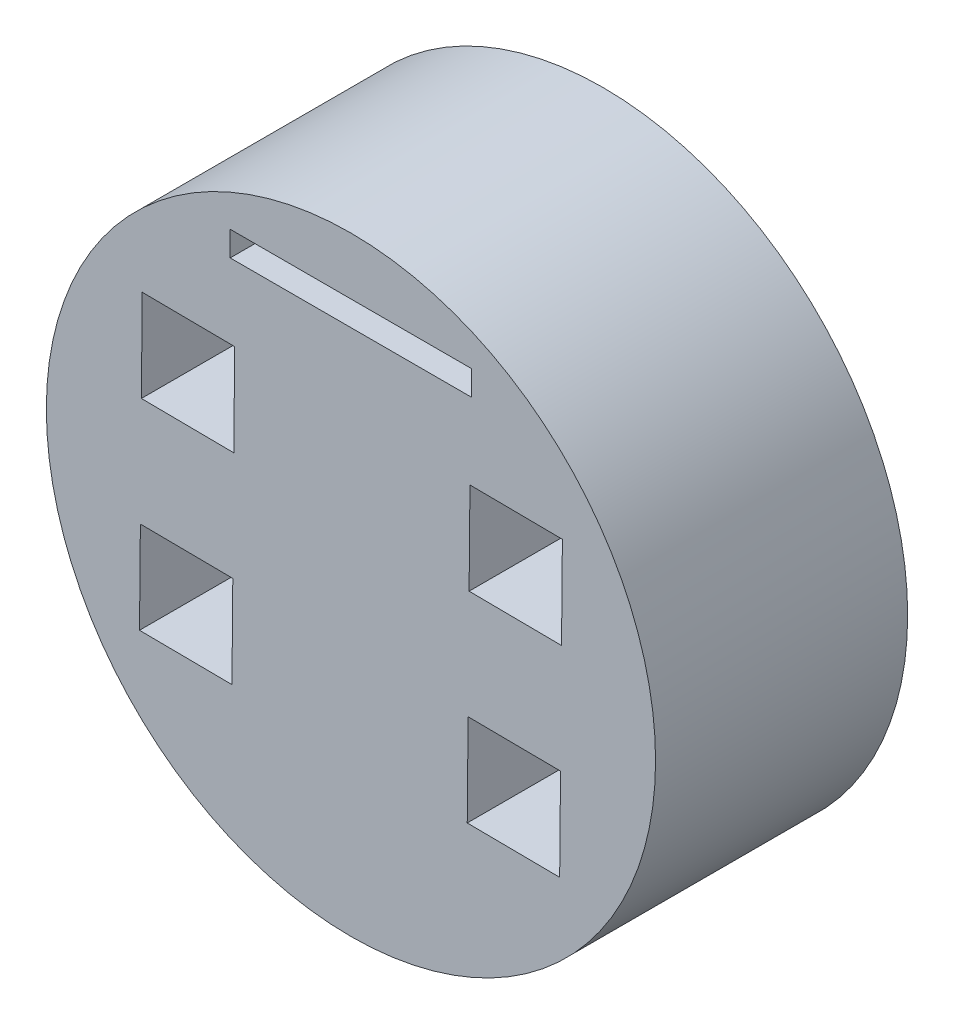
ISO-10303-21;
HEADER;
FILE_DESCRIPTION(('STEP AP214'),'2;1');
FILE_NAME('part.step','',(''),(''),'','','');
FILE_SCHEMA(('AUTOMOTIVE_DESIGN { 1 0 10303 214 1 1 1 1 }'));
ENDSEC;
DATA;
#1=APPLICATION_CONTEXT('core data for automotive mechanical design processes');
#2=APPLICATION_PROTOCOL_DEFINITION('international standard','automotive_design',2000,#1);
#3=PRODUCT_CONTEXT('',#1,'mechanical');
#4=PRODUCT('Part','Part','',(#3));
#5=PRODUCT_RELATED_PRODUCT_CATEGORY('part','',(#4));
#6=PRODUCT_DEFINITION_FORMATION('','',#4);
#7=PRODUCT_DEFINITION_CONTEXT('part definition',#1,'design');
#8=PRODUCT_DEFINITION('design','',#6,#7);
#9=PRODUCT_DEFINITION_SHAPE('','',#8);
#10=(LENGTH_UNIT() NAMED_UNIT(*) SI_UNIT(.MILLI.,.METRE.));
#11=(NAMED_UNIT(*) PLANE_ANGLE_UNIT() SI_UNIT($,.RADIAN.));
#12=(NAMED_UNIT(*) SI_UNIT($,.STERADIAN.) SOLID_ANGLE_UNIT());
#13=UNCERTAINTY_MEASURE_WITH_UNIT(LENGTH_MEASURE(1.E-05),#10,'distance_accuracy_value','');
#14=(GEOMETRIC_REPRESENTATION_CONTEXT(3) GLOBAL_UNCERTAINTY_ASSIGNED_CONTEXT((#13)) GLOBAL_UNIT_ASSIGNED_CONTEXT((#10,
#11,#12)) REPRESENTATION_CONTEXT('',''));
#15=CARTESIAN_POINT('',(0.,0.,0.));
#16=DIRECTION('',(0.,0.,1.));
#17=DIRECTION('',(1.,0.,0.));
#18=AXIS2_PLACEMENT_3D('',#15,#16,#17);
#19=CARTESIAN_POINT('',(0.,0.,76.2));
#20=DIRECTION('',(0.,0.,-1.));
#21=DIRECTION('',(-1.,0.,0.));
#22=AXIS2_PLACEMENT_3D('',#19,#20,#21);
#23=CYLINDRICAL_SURFACE('',#22,92.075);
#24=CARTESIAN_POINT('',(0.,0.,76.2));
#25=DIRECTION('',(0.,0.,1.));
#26=DIRECTION('',(1.,0.,0.));
#27=AXIS2_PLACEMENT_3D('',#24,#25,#26);
#28=CIRCLE('',#27,92.075);
#29=CARTESIAN_POINT('',(-92.075,0.,76.2));
#30=VERTEX_POINT('',#29);
#31=EDGE_CURVE('E11',#30,#30,#28,.T.);
#32=CARTESIAN_POINT('',(0.,0.,0.));
#33=DIRECTION('',(0.,0.,1.));
#34=DIRECTION('',(1.,0.,0.));
#35=AXIS2_PLACEMENT_3D('',#32,#33,#34);
#36=CIRCLE('',#35,92.075);
#37=CARTESIAN_POINT('',(-92.075,0.,0.));
#38=VERTEX_POINT('',#37);
#39=EDGE_CURVE('E38',#38,#38,#36,.T.);
#40=CARTESIAN_POINT('',(-92.075,0.,76.2));
#41=CARTESIAN_POINT('',(-92.075,0.,75.40625));
#42=CARTESIAN_POINT('',(-92.075,0.,74.6125));
#43=CARTESIAN_POINT('',(-92.075,0.,73.025));
#44=CARTESIAN_POINT('',(-92.075,0.,72.23125));
#45=CARTESIAN_POINT('',(-92.075,0.,70.64375));
#46=CARTESIAN_POINT('',(-92.075,0.,69.85));
#47=CARTESIAN_POINT('',(-92.075,0.,68.2625));
#48=CARTESIAN_POINT('',(-92.075,0.,67.46875));
#49=CARTESIAN_POINT('',(-92.075,0.,65.88125));
#50=CARTESIAN_POINT('',(-92.075,0.,65.0875));
#51=CARTESIAN_POINT('',(-92.075,0.,63.5));
#52=CARTESIAN_POINT('',(-92.075,0.,62.70625));
#53=CARTESIAN_POINT('',(-92.075,0.,61.11875));
#54=CARTESIAN_POINT('',(-92.075,0.,60.325));
#55=CARTESIAN_POINT('',(-92.075,0.,58.7375));
#56=CARTESIAN_POINT('',(-92.075,0.,57.94375));
#57=CARTESIAN_POINT('',(-92.075,0.,56.35625));
#58=CARTESIAN_POINT('',(-92.075,0.,55.5625));
#59=CARTESIAN_POINT('',(-92.075,0.,53.975));
#60=CARTESIAN_POINT('',(-92.075,0.,53.18125));
#61=CARTESIAN_POINT('',(-92.075,0.,51.59375));
#62=CARTESIAN_POINT('',(-92.075,0.,50.8));
#63=CARTESIAN_POINT('',(-92.075,0.,49.2125));
#64=CARTESIAN_POINT('',(-92.075,0.,48.41875));
#65=CARTESIAN_POINT('',(-92.075,0.,46.83125));
#66=CARTESIAN_POINT('',(-92.075,0.,46.0375));
#67=CARTESIAN_POINT('',(-92.075,0.,44.45));
#68=CARTESIAN_POINT('',(-92.075,0.,43.65625));
#69=CARTESIAN_POINT('',(-92.075,0.,42.06875));
#70=CARTESIAN_POINT('',(-92.075,0.,41.275));
#71=CARTESIAN_POINT('',(-92.075,0.,39.6875));
#72=CARTESIAN_POINT('',(-92.075,0.,38.89375));
#73=CARTESIAN_POINT('',(-92.075,0.,37.30625));
#74=CARTESIAN_POINT('',(-92.075,0.,36.5125));
#75=CARTESIAN_POINT('',(-92.075,0.,34.925));
#76=CARTESIAN_POINT('',(-92.075,0.,34.13125));
#77=CARTESIAN_POINT('',(-92.075,0.,32.54375));
#78=CARTESIAN_POINT('',(-92.075,0.,31.75));
#79=CARTESIAN_POINT('',(-92.075,0.,30.1625));
#80=CARTESIAN_POINT('',(-92.075,0.,29.36875));
#81=CARTESIAN_POINT('',(-92.075,0.,27.78125));
#82=CARTESIAN_POINT('',(-92.075,0.,26.9875));
#83=CARTESIAN_POINT('',(-92.075,0.,25.4));
#84=CARTESIAN_POINT('',(-92.075,0.,24.60625));
#85=CARTESIAN_POINT('',(-92.075,0.,23.01875));
#86=CARTESIAN_POINT('',(-92.075,0.,22.225));
#87=CARTESIAN_POINT('',(-92.075,0.,20.6375));
#88=CARTESIAN_POINT('',(-92.075,0.,19.84375));
#89=CARTESIAN_POINT('',(-92.075,0.,18.25625));
#90=CARTESIAN_POINT('',(-92.075,0.,17.4625));
#91=CARTESIAN_POINT('',(-92.075,0.,15.875));
#92=CARTESIAN_POINT('',(-92.075,0.,15.08125));
#93=CARTESIAN_POINT('',(-92.075,0.,13.49375));
#94=CARTESIAN_POINT('',(-92.075,0.,12.7));
#95=CARTESIAN_POINT('',(-92.075,0.,11.1125));
#96=CARTESIAN_POINT('',(-92.075,0.,10.31875));
#97=CARTESIAN_POINT('',(-92.075,0.,8.73125));
#98=CARTESIAN_POINT('',(-92.075,0.,7.93750000000001));
#99=CARTESIAN_POINT('',(-92.075,0.,6.35));
#100=CARTESIAN_POINT('',(-92.075,0.,5.55625));
#101=CARTESIAN_POINT('',(-92.075,0.,3.96875));
#102=CARTESIAN_POINT('',(-92.075,0.,3.175));
#103=CARTESIAN_POINT('',(-92.075,0.,1.5875));
#104=CARTESIAN_POINT('',(-92.075,0.,0.793750000000001));
#105=CARTESIAN_POINT('',(-92.075,0.,0.));
#106=B_SPLINE_CURVE_WITH_KNOTS('',3,(#40,#41,#42,#43,#44,#45,#46,#47,#48,#49,#50,#51,#52,#53,
#54,#55,#56,#57,#58,#59,#60,#61,#62,#63,#64,#65,#66,#67,#68,#69,#70,#71,#72,#73,#74,#75,#76,#77,
#78,#79,#80,#81,#82,#83,#84,#85,#86,#87,#88,#89,#90,#91,#92,#93,#94,#95,#96,#97,#98,#99,#100,
#101,#102,#103,#104,#105),.UNSPECIFIED.,.F.,.F.,(4,2,2,2,2,2,2,2,2,2,2,2,2,2,2,2,2,2,2,2,2,2,2,
2,2,2,2,2,2,2,2,2,4),(0.,2.38124999999999,4.76249999999999,7.14374999999999,9.52499999999999,
11.90625,14.2875,16.66875,19.05,21.43125,23.8125,26.19375,28.575,30.95625,33.3375,35.71875,38.1,
40.48125,42.8625,45.24375,47.625,50.00625,52.3875,54.76875,57.15,59.53125,61.9125,64.29375,
66.675,69.05625,71.4375,73.81875,76.2),.UNSPECIFIED.);
#107=EDGE_CURVE('BSEAM35',#30,#38,#106,.T.);
#108=ORIENTED_EDGE('',*,*,#31,.F.);
#109=ORIENTED_EDGE('',*,*,#39,.T.);
#110=ORIENTED_EDGE('',*,*,#107,.T.);
#111=ORIENTED_EDGE('',*,*,#107,.F.);
#112=EDGE_LOOP('',(#108,#110,#109,#111));
#113=FACE_BOUND('',#112,.T.);
#114=ADVANCED_FACE('F35',(#113),#23,.T.);
#115=CARTESIAN_POINT('',(0.,0.,76.2));
#116=DIRECTION('',(0.,0.,1.));
#117=DIRECTION('',(1.,0.,0.));
#118=AXIS2_PLACEMENT_3D('',#115,#116,#117);
#119=PLANE('',#118);
#120=DIRECTION('',(0.,-1.,0.));
#121=VECTOR('',#120,1.);
#122=CARTESIAN_POINT('',(-36.5,74.81,76.2));
#123=LINE('',#122,#121);
#124=CARTESIAN_POINT('',(-36.5,74.81,76.2));
#125=VERTEX_POINT('',#124);
#126=CARTESIAN_POINT('',(-36.5,67.31,76.2));
#127=VERTEX_POINT('',#126);
#128=EDGE_CURVE('E49',#125,#127,#123,.T.);
#129=ORIENTED_EDGE('',*,*,#128,.F.);
#130=DIRECTION('',(-1.,0.,0.));
#131=VECTOR('',#130,1.);
#132=CARTESIAN_POINT('',(-36.5,74.81,76.2));
#133=LINE('',#132,#131);
#134=CARTESIAN_POINT('',(36.5,74.81,76.2));
#135=VERTEX_POINT('',#134);
#136=EDGE_CURVE('E190',#135,#125,#133,.T.);
#137=ORIENTED_EDGE('',*,*,#136,.F.);
#138=DIRECTION('',(0.,1.,0.));
#139=VECTOR('',#138,1.);
#140=CARTESIAN_POINT('',(36.5,74.81,76.2));
#141=LINE('',#140,#139);
#142=CARTESIAN_POINT('',(36.5,67.31,76.2));
#143=VERTEX_POINT('',#142);
#144=EDGE_CURVE('E174',#143,#135,#141,.T.);
#145=ORIENTED_EDGE('',*,*,#144,.F.);
#146=DIRECTION('',(1.,0.,0.));
#147=VECTOR('',#146,1.);
#148=CARTESIAN_POINT('',(-36.5,67.31,76.2));
#149=LINE('',#148,#147);
#150=EDGE_CURVE('E183',#127,#143,#149,.T.);
#151=ORIENTED_EDGE('',*,*,#150,.F.);
#152=EDGE_LOOP('',(#129,#137,#145,#151));
#153=FACE_BOUND('',#152,.T.);
#154=DIRECTION('',(-0.999957406624021,0.0092295686661168,0.));
#155=VECTOR('',#154,1.);
#156=CARTESIAN_POINT('',(63.649675499303,15.9232191730642,76.2));
#157=LINE('',#156,#155);
#158=CARTESIAN_POINT('',(63.649675499303,15.9232191730642,76.2));
#159=VERTEX_POINT('',#158);
#160=CARTESIAN_POINT('',(35.7108655582279,16.1810933215955,76.2));
#161=VERTEX_POINT('',#160);
#162=EDGE_CURVE('E205',#159,#161,#157,.T.);
#163=ORIENTED_EDGE('',*,*,#162,.T.);
#164=DIRECTION('',(0.00922956866611825,0.999957406624021,0.));
#165=VECTOR('',#164,1.);
#166=CARTESIAN_POINT('',(35.9687397067593,44.1199032626708,76.2));
#167=LINE('',#166,#165);
#168=CARTESIAN_POINT('',(35.9687397067593,44.1199032626708,76.2));
#169=VERTEX_POINT('',#168);
#170=EDGE_CURVE('E228',#161,#169,#167,.T.);
#171=ORIENTED_EDGE('',*,*,#170,.T.);
#172=DIRECTION('',(0.999957406624021,-0.00922956866611652,0.));
#173=VECTOR('',#172,1.);
#174=CARTESIAN_POINT('',(63.9075496478345,43.8620291141395,76.2));
#175=LINE('',#174,#173);
#176=CARTESIAN_POINT('',(63.9075496478345,43.8620291141395,76.2));
#177=VERTEX_POINT('',#176);
#178=EDGE_CURVE('E224',#169,#177,#175,.T.);
#179=ORIENTED_EDGE('',*,*,#178,.T.);
#180=DIRECTION('',(-0.00922956866612223,-0.999957406624021,0.));
#181=VECTOR('',#180,1.);
#182=CARTESIAN_POINT('',(63.9075496478345,43.8620291141395,76.2));
#183=LINE('',#182,#181);
#184=EDGE_CURVE('E219',#177,#159,#183,.T.);
#185=ORIENTED_EDGE('',*,*,#184,.T.);
#186=EDGE_LOOP('',(#163,#171,#179,#185));
#187=FACE_BOUND('',#186,.T.);
#188=DIRECTION('',(-0.00922956866611577,-0.999957406624021,0.));
#189=VECTOR('',#188,1.);
#190=CARTESIAN_POINT('',(-35.1482310523414,44.7763101862051,76.2));
#191=LINE('',#190,#189);
#192=CARTESIAN_POINT('',(-35.1482310523414,44.7763101862051,76.2));
#193=VERTEX_POINT('',#192);
#194=CARTESIAN_POINT('',(-35.4061052008727,16.8375002451298,76.2));
#195=VERTEX_POINT('',#194);
#196=EDGE_CURVE('E239',#193,#195,#191,.T.);
#197=ORIENTED_EDGE('',*,*,#196,.T.);
#198=DIRECTION('',(-0.999957406624021,0.00922956866611543,0.));
#199=VECTOR('',#198,1.);
#200=CARTESIAN_POINT('',(-63.3449151419479,17.095374393661,76.2));
#201=LINE('',#200,#199);
#202=CARTESIAN_POINT('',(-63.3449151419479,17.095374393661,76.2));
#203=VERTEX_POINT('',#202);
#204=EDGE_CURVE('E261',#195,#203,#201,.T.);
#205=ORIENTED_EDGE('',*,*,#204,.T.);
#206=DIRECTION('',(0.0092295686661113,0.999957406624021,0.));
#207=VECTOR('',#206,1.);
#208=CARTESIAN_POINT('',(-63.0870409934167,45.0341843347363,76.2));
#209=LINE('',#208,#207);
#210=CARTESIAN_POINT('',(-63.0870409934167,45.0341843347363,76.2));
#211=VERTEX_POINT('',#210);
#212=EDGE_CURVE('E257',#203,#211,#209,.T.);
#213=ORIENTED_EDGE('',*,*,#212,.T.);
#214=DIRECTION('',(0.999957406624021,-0.00922956866611501,0.));
#215=VECTOR('',#214,1.);
#216=CARTESIAN_POINT('',(-63.0870409934167,45.0341843347363,76.2));
#217=LINE('',#216,#215);
#218=EDGE_CURVE('E253',#211,#193,#217,.T.);
#219=ORIENTED_EDGE('',*,*,#218,.T.);
#220=EDGE_LOOP('',(#197,#205,#213,#219));
#221=FACE_BOUND('',#220,.T.);
#222=DIRECTION('',(0.999957406624021,-0.0092295686661168,0.));
#223=VECTOR('',#222,1.);
#224=CARTESIAN_POINT('',(-63.649675499303,-15.9232191730642,76.2));
#225=LINE('',#224,#223);
#226=CARTESIAN_POINT('',(-63.649675499303,-15.9232191730642,76.2));
#227=VERTEX_POINT('',#226);
#228=CARTESIAN_POINT('',(-35.7108655582279,-16.1810933215955,76.2));
#229=VERTEX_POINT('',#228);
#230=EDGE_CURVE('E271',#227,#229,#225,.T.);
#231=ORIENTED_EDGE('',*,*,#230,.T.);
#232=DIRECTION('',(-0.00922956866611702,-0.999957406624021,0.));
#233=VECTOR('',#232,1.);
#234=CARTESIAN_POINT('',(-35.9687397067592,-44.1199032626708,76.2));
#235=LINE('',#234,#233);
#236=CARTESIAN_POINT('',(-35.9687397067592,-44.1199032626708,76.2));
#237=VERTEX_POINT('',#236);
#238=EDGE_CURVE('E291',#229,#237,#235,.T.);
#239=ORIENTED_EDGE('',*,*,#238,.T.);
#240=DIRECTION('',(-0.999957406624021,0.00922956866611504,0.));
#241=VECTOR('',#240,1.);
#242=CARTESIAN_POINT('',(-63.9075496478344,-43.8620291141395,76.2));
#243=LINE('',#242,#241);
#244=CARTESIAN_POINT('',(-63.9075496478344,-43.8620291141395,76.2));
#245=VERTEX_POINT('',#244);
#246=EDGE_CURVE('E287',#237,#245,#243,.T.);
#247=ORIENTED_EDGE('',*,*,#246,.T.);
#248=DIRECTION('',(0.00922956866612023,0.999957406624021,0.));
#249=VECTOR('',#248,1.);
#250=CARTESIAN_POINT('',(-63.9075496478344,-43.8620291141395,76.2));
#251=LINE('',#250,#249);
#252=EDGE_CURVE('E283',#245,#227,#251,.T.);
#253=ORIENTED_EDGE('',*,*,#252,.T.);
#254=EDGE_LOOP('',(#231,#239,#247,#253));
#255=FACE_BOUND('',#254,.T.);
#256=DIRECTION('',(0.00922956866611825,0.999957406624021,0.));
#257=VECTOR('',#256,1.);
#258=CARTESIAN_POINT('',(35.1482310523414,-44.776310186205,76.2));
#259=LINE('',#258,#257);
#260=CARTESIAN_POINT('',(35.1482310523414,-44.776310186205,76.2));
#261=VERTEX_POINT('',#260);
#262=CARTESIAN_POINT('',(35.4061052008728,-16.8375002451298,76.2));
#263=VERTEX_POINT('',#262);
#264=EDGE_CURVE('E301',#261,#263,#259,.T.);
#265=ORIENTED_EDGE('',*,*,#264,.T.);
#266=DIRECTION('',(0.999957406624021,-0.00922956866611717,0.));
#267=VECTOR('',#266,1.);
#268=CARTESIAN_POINT('',(63.3449151419479,-17.0953743936611,76.2));
#269=LINE('',#268,#267);
#270=CARTESIAN_POINT('',(63.3449151419479,-17.0953743936611,76.2));
#271=VERTEX_POINT('',#270);
#272=EDGE_CURVE('E322',#263,#271,#269,.T.);
#273=ORIENTED_EDGE('',*,*,#272,.T.);
#274=DIRECTION('',(-0.0092295686661128,-0.999957406624021,0.));
#275=VECTOR('',#274,1.);
#276=CARTESIAN_POINT('',(63.0870409934167,-45.0341843347363,76.2));
#277=LINE('',#276,#275);
#278=CARTESIAN_POINT('',(63.0870409934167,-45.0341843347363,76.2));
#279=VERTEX_POINT('',#278);
#280=EDGE_CURVE('E318',#271,#279,#277,.T.);
#281=ORIENTED_EDGE('',*,*,#280,.T.);
#282=DIRECTION('',(-0.999957406624021,0.00922956866611625,0.));
#283=VECTOR('',#282,1.);
#284=CARTESIAN_POINT('',(63.0870409934167,-45.0341843347363,76.2));
#285=LINE('',#284,#283);
#286=EDGE_CURVE('E313',#279,#261,#285,.T.);
#287=ORIENTED_EDGE('',*,*,#286,.T.);
#288=EDGE_LOOP('',(#265,#273,#281,#287));
#289=FACE_BOUND('',#288,.T.);
#290=ORIENTED_EDGE('',*,*,#31,.T.);
#291=EDGE_LOOP('',(#290));
#292=FACE_BOUND('',#291,.T.);
#293=ADVANCED_FACE('F187',(#153,#187,#221,#255,#289,#292),#119,.T.);
#294=CARTESIAN_POINT('',(0.,0.,0.));
#295=DIRECTION('',(0.,0.,1.));
#296=DIRECTION('',(1.,0.,0.));
#297=AXIS2_PLACEMENT_3D('',#294,#295,#296);
#298=PLANE('',#297);
#299=DIRECTION('',(1.,0.,0.));
#300=VECTOR('',#299,1.);
#301=CARTESIAN_POINT('',(-36.5,74.81,0.));
#302=LINE('',#301,#300);
#303=CARTESIAN_POINT('',(-36.5,74.81,0.));
#304=VERTEX_POINT('',#303);
#305=CARTESIAN_POINT('',(36.5,74.81,0.));
#306=VERTEX_POINT('',#305);
#307=EDGE_CURVE('E561',#304,#306,#302,.T.);
#308=ORIENTED_EDGE('',*,*,#307,.F.);
#309=DIRECTION('',(0.,1.,0.));
#310=VECTOR('',#309,1.);
#311=CARTESIAN_POINT('',(-36.5,74.81,0.));
#312=LINE('',#311,#310);
#313=CARTESIAN_POINT('',(-36.5,67.31,0.));
#314=VERTEX_POINT('',#313);
#315=EDGE_CURVE('E202',#314,#304,#312,.T.);
#316=ORIENTED_EDGE('',*,*,#315,.F.);
#317=DIRECTION('',(-1.,0.,0.));
#318=VECTOR('',#317,1.);
#319=CARTESIAN_POINT('',(-36.5,67.31,0.));
#320=LINE('',#319,#318);
#321=CARTESIAN_POINT('',(36.5,67.31,0.));
#322=VERTEX_POINT('',#321);
#323=EDGE_CURVE('E199',#322,#314,#320,.T.);
#324=ORIENTED_EDGE('',*,*,#323,.F.);
#325=DIRECTION('',(0.,-1.,0.));
#326=VECTOR('',#325,1.);
#327=CARTESIAN_POINT('',(36.5,74.81,0.));
#328=LINE('',#327,#326);
#329=EDGE_CURVE('E177',#306,#322,#328,.T.);
#330=ORIENTED_EDGE('',*,*,#329,.F.);
#331=EDGE_LOOP('',(#308,#316,#324,#330));
#332=FACE_BOUND('',#331,.T.);
#333=DIRECTION('',(0.00922956866611825,0.999957406624021,0.));
#334=VECTOR('',#333,1.);
#335=CARTESIAN_POINT('',(35.9687397067593,44.1199032626708,0.));
#336=LINE('',#335,#334);
#337=CARTESIAN_POINT('',(35.7108655582279,16.1810933215955,0.));
#338=VERTEX_POINT('',#337);
#339=CARTESIAN_POINT('',(35.9687397067593,44.1199032626708,0.));
#340=VERTEX_POINT('',#339);
#341=EDGE_CURVE('E206',#338,#340,#336,.T.);
#342=ORIENTED_EDGE('',*,*,#341,.F.);
#343=DIRECTION('',(-0.999957406624021,0.00922956866611681,0.));
#344=VECTOR('',#343,1.);
#345=CARTESIAN_POINT('',(63.649675499303,15.9232191730642,0.));
#346=LINE('',#345,#344);
#347=CARTESIAN_POINT('',(63.649675499303,15.9232191730642,0.));
#348=VERTEX_POINT('',#347);
#349=EDGE_CURVE('E209',#348,#338,#346,.T.);
#350=ORIENTED_EDGE('',*,*,#349,.F.);
#351=DIRECTION('',(-0.00922956866612223,-0.999957406624021,0.));
#352=VECTOR('',#351,1.);
#353=CARTESIAN_POINT('',(63.9075496478345,43.8620291141395,0.));
#354=LINE('',#353,#352);
#355=CARTESIAN_POINT('',(63.9075496478345,43.8620291141395,0.));
#356=VERTEX_POINT('',#355);
#357=EDGE_CURVE('E212',#356,#348,#354,.T.);
#358=ORIENTED_EDGE('',*,*,#357,.F.);
#359=DIRECTION('',(0.999957406624021,-0.00922956866611652,0.));
#360=VECTOR('',#359,1.);
#361=CARTESIAN_POINT('',(63.9075496478345,43.8620291141395,0.));
#362=LINE('',#361,#360);
#363=EDGE_CURVE('E203',#340,#356,#362,.T.);
#364=ORIENTED_EDGE('',*,*,#363,.F.);
#365=EDGE_LOOP('',(#342,#350,#358,#364));
#366=FACE_BOUND('',#365,.T.);
#367=DIRECTION('',(-0.999957406624021,0.00922956866611543,0.));
#368=VECTOR('',#367,1.);
#369=CARTESIAN_POINT('',(-63.3449151419479,17.095374393661,0.));
#370=LINE('',#369,#368);
#371=CARTESIAN_POINT('',(-35.4061052008727,16.8375002451298,0.));
#372=VERTEX_POINT('',#371);
#373=CARTESIAN_POINT('',(-63.3449151419479,17.095374393661,0.));
#374=VERTEX_POINT('',#373);
#375=EDGE_CURVE('E240',#372,#374,#370,.T.);
#376=ORIENTED_EDGE('',*,*,#375,.F.);
#377=DIRECTION('',(-0.00922956866611576,-0.999957406624021,0.));
#378=VECTOR('',#377,1.);
#379=CARTESIAN_POINT('',(-35.1482310523414,44.7763101862051,0.));
#380=LINE('',#379,#378);
#381=CARTESIAN_POINT('',(-35.1482310523414,44.7763101862051,0.));
#382=VERTEX_POINT('',#381);
#383=EDGE_CURVE('E243',#382,#372,#380,.T.);
#384=ORIENTED_EDGE('',*,*,#383,.F.);
#385=DIRECTION('',(0.999957406624021,-0.00922956866611501,0.));
#386=VECTOR('',#385,1.);
#387=CARTESIAN_POINT('',(-63.0870409934167,45.0341843347363,0.));
#388=LINE('',#387,#386);
#389=CARTESIAN_POINT('',(-63.0870409934167,45.0341843347363,0.));
#390=VERTEX_POINT('',#389);
#391=EDGE_CURVE('E246',#390,#382,#388,.T.);
#392=ORIENTED_EDGE('',*,*,#391,.F.);
#393=DIRECTION('',(0.0092295686661113,0.999957406624021,0.));
#394=VECTOR('',#393,1.);
#395=CARTESIAN_POINT('',(-63.0870409934167,45.0341843347363,0.));
#396=LINE('',#395,#394);
#397=EDGE_CURVE('E237',#374,#390,#396,.T.);
#398=ORIENTED_EDGE('',*,*,#397,.F.);
#399=EDGE_LOOP('',(#376,#384,#392,#398));
#400=FACE_BOUND('',#399,.T.);
#401=DIRECTION('',(-0.00922956866611702,-0.999957406624021,0.));
#402=VECTOR('',#401,1.);
#403=CARTESIAN_POINT('',(-35.9687397067592,-44.1199032626708,0.));
#404=LINE('',#403,#402);
#405=CARTESIAN_POINT('',(-35.7108655582279,-16.1810933215955,0.));
#406=VERTEX_POINT('',#405);
#407=CARTESIAN_POINT('',(-35.9687397067592,-44.1199032626708,0.));
#408=VERTEX_POINT('',#407);
#409=EDGE_CURVE('E272',#406,#408,#404,.T.);
#410=ORIENTED_EDGE('',*,*,#409,.F.);
#411=DIRECTION('',(0.999957406624021,-0.00922956866611681,0.));
#412=VECTOR('',#411,1.);
#413=CARTESIAN_POINT('',(-63.649675499303,-15.9232191730642,0.));
#414=LINE('',#413,#412);
#415=CARTESIAN_POINT('',(-63.649675499303,-15.9232191730642,0.));
#416=VERTEX_POINT('',#415);
#417=EDGE_CURVE('E275',#416,#406,#414,.T.);
#418=ORIENTED_EDGE('',*,*,#417,.F.);
#419=DIRECTION('',(0.00922956866612023,0.999957406624021,0.));
#420=VECTOR('',#419,1.);
#421=CARTESIAN_POINT('',(-63.9075496478344,-43.8620291141395,0.));
#422=LINE('',#421,#420);
#423=CARTESIAN_POINT('',(-63.9075496478344,-43.8620291141395,0.));
#424=VERTEX_POINT('',#423);
#425=EDGE_CURVE('E201',#424,#416,#422,.T.);
#426=ORIENTED_EDGE('',*,*,#425,.F.);
#427=DIRECTION('',(-0.999957406624021,0.00922956866611504,0.));
#428=VECTOR('',#427,1.);
#429=CARTESIAN_POINT('',(-63.9075496478344,-43.8620291141395,0.));
#430=LINE('',#429,#428);
#431=EDGE_CURVE('E269',#408,#424,#430,.T.);
#432=ORIENTED_EDGE('',*,*,#431,.F.);
#433=EDGE_LOOP('',(#410,#418,#426,#432));
#434=FACE_BOUND('',#433,.T.);
#435=DIRECTION('',(0.999957406624021,-0.00922956866611717,0.));
#436=VECTOR('',#435,1.);
#437=CARTESIAN_POINT('',(63.3449151419479,-17.0953743936611,0.));
#438=LINE('',#437,#436);
#439=CARTESIAN_POINT('',(35.4061052008728,-16.8375002451298,0.));
#440=VERTEX_POINT('',#439);
#441=CARTESIAN_POINT('',(63.3449151419479,-17.0953743936611,0.));
#442=VERTEX_POINT('',#441);
#443=EDGE_CURVE('E302',#440,#442,#438,.T.);
#444=ORIENTED_EDGE('',*,*,#443,.F.);
#445=DIRECTION('',(0.00922956866611825,0.999957406624021,0.));
#446=VECTOR('',#445,1.);
#447=CARTESIAN_POINT('',(35.1482310523414,-44.776310186205,0.));
#448=LINE('',#447,#446);
#449=CARTESIAN_POINT('',(35.1482310523414,-44.776310186205,0.));
#450=VERTEX_POINT('',#449);
#451=EDGE_CURVE('E305',#450,#440,#448,.T.);
#452=ORIENTED_EDGE('',*,*,#451,.F.);
#453=DIRECTION('',(-0.999957406624021,0.00922956866611625,0.));
#454=VECTOR('',#453,1.);
#455=CARTESIAN_POINT('',(63.0870409934167,-45.0341843347363,0.));
#456=LINE('',#455,#454);
#457=CARTESIAN_POINT('',(63.0870409934167,-45.0341843347363,0.));
#458=VERTEX_POINT('',#457);
#459=EDGE_CURVE('E236',#458,#450,#456,.T.);
#460=ORIENTED_EDGE('',*,*,#459,.F.);
#461=DIRECTION('',(-0.0092295686661128,-0.999957406624021,0.));
#462=VECTOR('',#461,1.);
#463=CARTESIAN_POINT('',(63.0870409934167,-45.0341843347363,0.));
#464=LINE('',#463,#462);
#465=EDGE_CURVE('E299',#442,#458,#464,.T.);
#466=ORIENTED_EDGE('',*,*,#465,.F.);
#467=EDGE_LOOP('',(#444,#452,#460,#466));
#468=FACE_BOUND('',#467,.T.);
#469=ORIENTED_EDGE('',*,*,#39,.F.);
#470=EDGE_LOOP('',(#469));
#471=FACE_BOUND('',#470,.T.);
#472=ADVANCED_FACE('F335',(#332,#366,#400,#434,#468,#471),#298,.F.);
#473=CARTESIAN_POINT('',(35.1482310523414,-44.776310186205,116.076133053471));
#474=DIRECTION('',(-0.999957406624021,0.00922956866611825,0.));
#475=DIRECTION('',(-0.00922956866611825,-0.999957406624021,0.));
#476=AXIS2_PLACEMENT_3D('',#473,#474,#475);
#477=PLANE('',#476);
#478=DIRECTION('',(0.,0.,-1.));
#479=VECTOR('',#478,1.);
#480=CARTESIAN_POINT('',(35.1482310523414,-44.776310186205,116.076133053471));
#481=LINE('',#480,#479);
#482=EDGE_CURVE('E316',#261,#450,#481,.T.);
#483=ORIENTED_EDGE('',*,*,#482,.T.);
#484=ORIENTED_EDGE('',*,*,#451,.T.);
#485=DIRECTION('',(0.,0.,-1.));
#486=VECTOR('',#485,1.);
#487=CARTESIAN_POINT('',(35.4061052008728,-16.8375002451298,116.076133053471));
#488=LINE('',#487,#486);
#489=EDGE_CURVE('E312',#263,#440,#488,.T.);
#490=ORIENTED_EDGE('',*,*,#489,.F.);
#491=ORIENTED_EDGE('',*,*,#264,.F.);
#492=EDGE_LOOP('',(#483,#484,#490,#491));
#493=FACE_BOUND('',#492,.T.);
#494=ADVANCED_FACE('F337',(#493),#477,.F.);
#495=CARTESIAN_POINT('',(63.3449151419479,-17.0953743936611,116.076133053471));
#496=DIRECTION('',(0.00922956866611717,0.999957406624021,0.));
#497=DIRECTION('',(-0.999957406624021,0.00922956866611717,0.));
#498=AXIS2_PLACEMENT_3D('',#495,#496,#497);
#499=PLANE('',#498);
#500=ORIENTED_EDGE('',*,*,#489,.T.);
#501=ORIENTED_EDGE('',*,*,#443,.T.);
#502=DIRECTION('',(0.,0.,-1.));
#503=VECTOR('',#502,1.);
#504=CARTESIAN_POINT('',(63.3449151419479,-17.0953743936611,116.076133053471));
#505=LINE('',#504,#503);
#506=EDGE_CURVE('E321',#271,#442,#505,.T.);
#507=ORIENTED_EDGE('',*,*,#506,.F.);
#508=ORIENTED_EDGE('',*,*,#272,.F.);
#509=EDGE_LOOP('',(#500,#501,#507,#508));
#510=FACE_BOUND('',#509,.T.);
#511=ADVANCED_FACE('F344',(#510),#499,.F.);
#512=CARTESIAN_POINT('',(63.0870409934167,-45.0341843347363,116.076133053471));
#513=DIRECTION('',(0.999957406624021,-0.0092295686661128,0.));
#514=DIRECTION('',(0.0092295686661128,0.999957406624021,0.));
#515=AXIS2_PLACEMENT_3D('',#512,#513,#514);
#516=PLANE('',#515);
#517=ORIENTED_EDGE('',*,*,#506,.T.);
#518=ORIENTED_EDGE('',*,*,#465,.T.);
#519=DIRECTION('',(0.,0.,-1.));
#520=VECTOR('',#519,1.);
#521=CARTESIAN_POINT('',(63.0870409934167,-45.0341843347363,116.076133053471));
#522=LINE('',#521,#520);
#523=EDGE_CURVE('E317',#279,#458,#522,.T.);
#524=ORIENTED_EDGE('',*,*,#523,.F.);
#525=ORIENTED_EDGE('',*,*,#280,.F.);
#526=EDGE_LOOP('',(#517,#518,#524,#525));
#527=FACE_BOUND('',#526,.T.);
#528=ADVANCED_FACE('F380',(#527),#516,.F.);
#529=CARTESIAN_POINT('',(63.0870409934167,-45.0341843347363,116.076133053471));
#530=DIRECTION('',(-0.00922956866611625,-0.999957406624021,0.));
#531=DIRECTION('',(0.999957406624021,-0.00922956866611625,0.));
#532=AXIS2_PLACEMENT_3D('',#529,#530,#531);
#533=PLANE('',#532);
#534=ORIENTED_EDGE('',*,*,#523,.T.);
#535=ORIENTED_EDGE('',*,*,#459,.T.);
#536=ORIENTED_EDGE('',*,*,#482,.F.);
#537=ORIENTED_EDGE('',*,*,#286,.F.);
#538=EDGE_LOOP('',(#534,#535,#536,#537));
#539=FACE_BOUND('',#538,.T.);
#540=ADVANCED_FACE('F388',(#539),#533,.F.);
#541=CARTESIAN_POINT('',(-63.649675499303,-15.9232191730642,116.076133053471));
#542=DIRECTION('',(0.0092295686661168,0.999957406624021,0.));
#543=DIRECTION('',(-0.999957406624021,0.0092295686661168,0.));
#544=AXIS2_PLACEMENT_3D('',#541,#542,#543);
#545=PLANE('',#544);
#546=DIRECTION('',(0.,0.,-1.));
#547=VECTOR('',#546,1.);
#548=CARTESIAN_POINT('',(-63.649675499303,-15.9232191730642,116.076133053471));
#549=LINE('',#548,#547);
#550=EDGE_CURVE('E249',#227,#416,#549,.T.);
#551=ORIENTED_EDGE('',*,*,#550,.T.);
#552=ORIENTED_EDGE('',*,*,#417,.T.);
#553=DIRECTION('',(0.,0.,-1.));
#554=VECTOR('',#553,1.);
#555=CARTESIAN_POINT('',(-35.7108655582279,-16.1810933215955,116.076133053471));
#556=LINE('',#555,#554);
#557=EDGE_CURVE('E282',#229,#406,#556,.T.);
#558=ORIENTED_EDGE('',*,*,#557,.F.);
#559=ORIENTED_EDGE('',*,*,#230,.F.);
#560=EDGE_LOOP('',(#551,#552,#558,#559));
#561=FACE_BOUND('',#560,.T.);
#562=ADVANCED_FACE('F396',(#561),#545,.F.);
#563=CARTESIAN_POINT('',(-35.9687397067592,-44.1199032626708,116.076133053471));
#564=DIRECTION('',(0.999957406624021,-0.00922956866611702,0.));
#565=DIRECTION('',(0.00922956866611702,0.999957406624021,0.));
#566=AXIS2_PLACEMENT_3D('',#563,#564,#565);
#567=PLANE('',#566);
#568=ORIENTED_EDGE('',*,*,#557,.T.);
#569=ORIENTED_EDGE('',*,*,#409,.T.);
#570=DIRECTION('',(0.,0.,-1.));
#571=VECTOR('',#570,1.);
#572=CARTESIAN_POINT('',(-35.9687397067592,-44.1199032626708,116.076133053471));
#573=LINE('',#572,#571);
#574=EDGE_CURVE('E290',#237,#408,#573,.T.);
#575=ORIENTED_EDGE('',*,*,#574,.F.);
#576=ORIENTED_EDGE('',*,*,#238,.F.);
#577=EDGE_LOOP('',(#568,#569,#575,#576));
#578=FACE_BOUND('',#577,.T.);
#579=ADVANCED_FACE('F404',(#578),#567,.F.);
#580=CARTESIAN_POINT('',(-63.9075496478344,-43.8620291141395,116.076133053471));
#581=DIRECTION('',(-0.00922956866611504,-0.999957406624021,0.));
#582=DIRECTION('',(0.999957406624021,-0.00922956866611504,0.));
#583=AXIS2_PLACEMENT_3D('',#580,#581,#582);
#584=PLANE('',#583);
#585=ORIENTED_EDGE('',*,*,#574,.T.);
#586=ORIENTED_EDGE('',*,*,#431,.T.);
#587=DIRECTION('',(0.,0.,-1.));
#588=VECTOR('',#587,1.);
#589=CARTESIAN_POINT('',(-63.9075496478344,-43.8620291141395,116.076133053471));
#590=LINE('',#589,#588);
#591=EDGE_CURVE('E286',#245,#424,#590,.T.);
#592=ORIENTED_EDGE('',*,*,#591,.F.);
#593=ORIENTED_EDGE('',*,*,#246,.F.);
#594=EDGE_LOOP('',(#585,#586,#592,#593));
#595=FACE_BOUND('',#594,.T.);
#596=ADVANCED_FACE('F412',(#595),#584,.F.);
#597=CARTESIAN_POINT('',(-63.9075496478344,-43.8620291141395,116.076133053471));
#598=DIRECTION('',(-0.999957406624021,0.00922956866612023,0.));
#599=DIRECTION('',(-0.00922956866612023,-0.999957406624021,0.));
#600=AXIS2_PLACEMENT_3D('',#597,#598,#599);
#601=PLANE('',#600);
#602=ORIENTED_EDGE('',*,*,#591,.T.);
#603=ORIENTED_EDGE('',*,*,#425,.T.);
#604=ORIENTED_EDGE('',*,*,#550,.F.);
#605=ORIENTED_EDGE('',*,*,#252,.F.);
#606=EDGE_LOOP('',(#602,#603,#604,#605));
#607=FACE_BOUND('',#606,.T.);
#608=ADVANCED_FACE('F420',(#607),#601,.F.);
#609=CARTESIAN_POINT('',(-35.1482310523414,44.7763101862051,116.076133053471));
#610=DIRECTION('',(0.999957406624021,-0.00922956866611577,0.));
#611=DIRECTION('',(0.00922956866611577,0.999957406624021,0.));
#612=AXIS2_PLACEMENT_3D('',#609,#610,#611);
#613=PLANE('',#612);
#614=DIRECTION('',(0.,0.,-1.));
#615=VECTOR('',#614,1.);
#616=CARTESIAN_POINT('',(-35.1482310523414,44.7763101862051,116.076133053471));
#617=LINE('',#616,#615);
#618=EDGE_CURVE('E215',#193,#382,#617,.T.);
#619=ORIENTED_EDGE('',*,*,#618,.T.);
#620=ORIENTED_EDGE('',*,*,#383,.T.);
#621=DIRECTION('',(0.,0.,-1.));
#622=VECTOR('',#621,1.);
#623=CARTESIAN_POINT('',(-35.4061052008727,16.8375002451298,116.076133053471));
#624=LINE('',#623,#622);
#625=EDGE_CURVE('E252',#195,#372,#624,.T.);
#626=ORIENTED_EDGE('',*,*,#625,.F.);
#627=ORIENTED_EDGE('',*,*,#196,.F.);
#628=EDGE_LOOP('',(#619,#620,#626,#627));
#629=FACE_BOUND('',#628,.T.);
#630=ADVANCED_FACE('F428',(#629),#613,.F.);
#631=CARTESIAN_POINT('',(-63.3449151419479,17.095374393661,116.076133053471));
#632=DIRECTION('',(-0.00922956866611543,-0.999957406624021,0.));
#633=DIRECTION('',(0.999957406624021,-0.00922956866611543,0.));
#634=AXIS2_PLACEMENT_3D('',#631,#632,#633);
#635=PLANE('',#634);
#636=ORIENTED_EDGE('',*,*,#625,.T.);
#637=ORIENTED_EDGE('',*,*,#375,.T.);
#638=DIRECTION('',(0.,0.,-1.));
#639=VECTOR('',#638,1.);
#640=CARTESIAN_POINT('',(-63.3449151419479,17.095374393661,116.076133053471));
#641=LINE('',#640,#639);
#642=EDGE_CURVE('E260',#203,#374,#641,.T.);
#643=ORIENTED_EDGE('',*,*,#642,.F.);
#644=ORIENTED_EDGE('',*,*,#204,.F.);
#645=EDGE_LOOP('',(#636,#637,#643,#644));
#646=FACE_BOUND('',#645,.T.);
#647=ADVANCED_FACE('F436',(#646),#635,.F.);
#648=CARTESIAN_POINT('',(-63.0870409934167,45.0341843347363,116.076133053471));
#649=DIRECTION('',(-0.999957406624021,0.0092295686661113,0.));
#650=DIRECTION('',(-0.0092295686661113,-0.999957406624021,0.));
#651=AXIS2_PLACEMENT_3D('',#648,#649,#650);
#652=PLANE('',#651);
#653=ORIENTED_EDGE('',*,*,#642,.T.);
#654=ORIENTED_EDGE('',*,*,#397,.T.);
#655=DIRECTION('',(0.,0.,-1.));
#656=VECTOR('',#655,1.);
#657=CARTESIAN_POINT('',(-63.0870409934167,45.0341843347363,116.076133053471));
#658=LINE('',#657,#656);
#659=EDGE_CURVE('E256',#211,#390,#658,.T.);
#660=ORIENTED_EDGE('',*,*,#659,.F.);
#661=ORIENTED_EDGE('',*,*,#212,.F.);
#662=EDGE_LOOP('',(#653,#654,#660,#661));
#663=FACE_BOUND('',#662,.T.);
#664=ADVANCED_FACE('F444',(#663),#652,.F.);
#665=CARTESIAN_POINT('',(-63.0870409934167,45.0341843347363,116.076133053471));
#666=DIRECTION('',(0.00922956866611501,0.999957406624021,0.));
#667=DIRECTION('',(-0.999957406624021,0.00922956866611501,0.));
#668=AXIS2_PLACEMENT_3D('',#665,#666,#667);
#669=PLANE('',#668);
#670=ORIENTED_EDGE('',*,*,#659,.T.);
#671=ORIENTED_EDGE('',*,*,#391,.T.);
#672=ORIENTED_EDGE('',*,*,#618,.F.);
#673=ORIENTED_EDGE('',*,*,#218,.F.);
#674=EDGE_LOOP('',(#670,#671,#672,#673));
#675=FACE_BOUND('',#674,.T.);
#676=ADVANCED_FACE('F452',(#675),#669,.F.);
#677=CARTESIAN_POINT('',(63.649675499303,15.9232191730642,116.076133053471));
#678=DIRECTION('',(-0.0092295686661168,-0.999957406624021,0.));
#679=DIRECTION('',(0.999957406624021,-0.0092295686661168,0.));
#680=AXIS2_PLACEMENT_3D('',#677,#678,#679);
#681=PLANE('',#680);
#682=DIRECTION('',(0.,0.,-1.));
#683=VECTOR('',#682,1.);
#684=CARTESIAN_POINT('',(63.649675499303,15.9232191730642,116.076133053471));
#685=LINE('',#684,#683);
#686=EDGE_CURVE('E222',#159,#348,#685,.T.);
#687=ORIENTED_EDGE('',*,*,#686,.T.);
#688=ORIENTED_EDGE('',*,*,#349,.T.);
#689=DIRECTION('',(0.,0.,-1.));
#690=VECTOR('',#689,1.);
#691=CARTESIAN_POINT('',(35.7108655582279,16.1810933215955,116.076133053471));
#692=LINE('',#691,#690);
#693=EDGE_CURVE('E218',#161,#338,#692,.T.);
#694=ORIENTED_EDGE('',*,*,#693,.F.);
#695=ORIENTED_EDGE('',*,*,#162,.F.);
#696=EDGE_LOOP('',(#687,#688,#694,#695));
#697=FACE_BOUND('',#696,.T.);
#698=ADVANCED_FACE('F460',(#697),#681,.F.);
#699=CARTESIAN_POINT('',(35.9687397067593,44.1199032626708,116.076133053471));
#700=DIRECTION('',(-0.999957406624021,0.00922956866611825,0.));
#701=DIRECTION('',(-0.00922956866611825,-0.999957406624021,0.));
#702=AXIS2_PLACEMENT_3D('',#699,#700,#701);
#703=PLANE('',#702);
#704=ORIENTED_EDGE('',*,*,#693,.T.);
#705=ORIENTED_EDGE('',*,*,#341,.T.);
#706=DIRECTION('',(0.,0.,-1.));
#707=VECTOR('',#706,1.);
#708=CARTESIAN_POINT('',(35.9687397067593,44.1199032626708,116.076133053471));
#709=LINE('',#708,#707);
#710=EDGE_CURVE('E227',#169,#340,#709,.T.);
#711=ORIENTED_EDGE('',*,*,#710,.F.);
#712=ORIENTED_EDGE('',*,*,#170,.F.);
#713=EDGE_LOOP('',(#704,#705,#711,#712));
#714=FACE_BOUND('',#713,.T.);
#715=ADVANCED_FACE('F468',(#714),#703,.F.);
#716=CARTESIAN_POINT('',(63.9075496478345,43.8620291141395,116.076133053471));
#717=DIRECTION('',(0.00922956866611652,0.999957406624021,0.));
#718=DIRECTION('',(-0.999957406624021,0.00922956866611652,0.));
#719=AXIS2_PLACEMENT_3D('',#716,#717,#718);
#720=PLANE('',#719);
#721=ORIENTED_EDGE('',*,*,#710,.T.);
#722=ORIENTED_EDGE('',*,*,#363,.T.);
#723=DIRECTION('',(0.,0.,-1.));
#724=VECTOR('',#723,1.);
#725=CARTESIAN_POINT('',(63.9075496478345,43.8620291141395,116.076133053471));
#726=LINE('',#725,#724);
#727=EDGE_CURVE('E223',#177,#356,#726,.T.);
#728=ORIENTED_EDGE('',*,*,#727,.F.);
#729=ORIENTED_EDGE('',*,*,#178,.F.);
#730=EDGE_LOOP('',(#721,#722,#728,#729));
#731=FACE_BOUND('',#730,.T.);
#732=ADVANCED_FACE('F476',(#731),#720,.F.);
#733=CARTESIAN_POINT('',(63.9075496478345,43.8620291141395,116.076133053471));
#734=DIRECTION('',(0.999957406624021,-0.00922956866612223,0.));
#735=DIRECTION('',(0.00922956866612223,0.999957406624021,0.));
#736=AXIS2_PLACEMENT_3D('',#733,#734,#735);
#737=PLANE('',#736);
#738=ORIENTED_EDGE('',*,*,#727,.T.);
#739=ORIENTED_EDGE('',*,*,#357,.T.);
#740=ORIENTED_EDGE('',*,*,#686,.F.);
#741=ORIENTED_EDGE('',*,*,#184,.F.);
#742=EDGE_LOOP('',(#738,#739,#740,#741));
#743=FACE_BOUND('',#742,.T.);
#744=ADVANCED_FACE('F484',(#743),#737,.F.);
#745=CARTESIAN_POINT('',(-36.5,74.81,-73.3842626180845));
#746=DIRECTION('',(-1.,0.,0.));
#747=DIRECTION('',(0.,-1.,0.));
#748=AXIS2_PLACEMENT_3D('',#745,#746,#747);
#749=PLANE('',#748);
#750=ORIENTED_EDGE('',*,*,#315,.T.);
#751=DIRECTION('',(0.,0.,1.));
#752=VECTOR('',#751,1.);
#753=CARTESIAN_POINT('',(-36.5,74.81,-73.3842626180845));
#754=LINE('',#753,#752);
#755=EDGE_CURVE('E195',#304,#125,#754,.T.);
#756=ORIENTED_EDGE('',*,*,#755,.T.);
#757=ORIENTED_EDGE('',*,*,#128,.T.);
#758=DIRECTION('',(0.,0.,1.));
#759=VECTOR('',#758,1.);
#760=CARTESIAN_POINT('',(-36.5,67.31,-73.3842626180845));
#761=LINE('',#760,#759);
#762=EDGE_CURVE('E180',#314,#127,#761,.T.);
#763=ORIENTED_EDGE('',*,*,#762,.F.);
#764=EDGE_LOOP('',(#750,#756,#757,#763));
#765=FACE_BOUND('',#764,.T.);
#766=ADVANCED_FACE('F491',(#765),#749,.F.);
#767=CARTESIAN_POINT('',(-36.5,74.81,-73.3842626180845));
#768=DIRECTION('',(0.,1.,0.));
#769=DIRECTION('',(-1.,0.,0.));
#770=AXIS2_PLACEMENT_3D('',#767,#768,#769);
#771=PLANE('',#770);
#772=ORIENTED_EDGE('',*,*,#307,.T.);
#773=DIRECTION('',(0.,0.,1.));
#774=VECTOR('',#773,1.);
#775=CARTESIAN_POINT('',(36.5,74.81,-73.3842626180845));
#776=LINE('',#775,#774);
#777=EDGE_CURVE('E179',#306,#135,#776,.T.);
#778=ORIENTED_EDGE('',*,*,#777,.T.);
#779=ORIENTED_EDGE('',*,*,#136,.T.);
#780=ORIENTED_EDGE('',*,*,#755,.F.);
#781=EDGE_LOOP('',(#772,#778,#779,#780));
#782=FACE_BOUND('',#781,.T.);
#783=ADVANCED_FACE('F498',(#782),#771,.F.);
#784=CARTESIAN_POINT('',(36.5,74.81,-73.3842626180845));
#785=DIRECTION('',(1.,0.,0.));
#786=DIRECTION('',(0.,1.,0.));
#787=AXIS2_PLACEMENT_3D('',#784,#785,#786);
#788=PLANE('',#787);
#789=ORIENTED_EDGE('',*,*,#329,.T.);
#790=DIRECTION('',(0.,0.,1.));
#791=VECTOR('',#790,1.);
#792=CARTESIAN_POINT('',(36.5,67.31,-73.3842626180845));
#793=LINE('',#792,#791);
#794=EDGE_CURVE('E57',#322,#143,#793,.T.);
#795=ORIENTED_EDGE('',*,*,#794,.T.);
#796=ORIENTED_EDGE('',*,*,#144,.T.);
#797=ORIENTED_EDGE('',*,*,#777,.F.);
#798=EDGE_LOOP('',(#789,#795,#796,#797));
#799=FACE_BOUND('',#798,.T.);
#800=ADVANCED_FACE('F171',(#799),#788,.F.);
#801=CARTESIAN_POINT('',(-36.5,67.31,-73.3842626180845));
#802=DIRECTION('',(0.,-1.,0.));
#803=DIRECTION('',(1.,0.,0.));
#804=AXIS2_PLACEMENT_3D('',#801,#802,#803);
#805=PLANE('',#804);
#806=ORIENTED_EDGE('',*,*,#323,.T.);
#807=ORIENTED_EDGE('',*,*,#762,.T.);
#808=ORIENTED_EDGE('',*,*,#150,.T.);
#809=ORIENTED_EDGE('',*,*,#794,.F.);
#810=EDGE_LOOP('',(#806,#807,#808,#809));
#811=FACE_BOUND('',#810,.T.);
#812=ADVANCED_FACE('F184',(#811),#805,.F.);
#813=CLOSED_SHELL('',(#114,#293,#472,#494,#511,#528,#540,#562,#579,#596,#608,#630,#647,#664,
#676,#698,#715,#732,#744,#766,#783,#800,#812));
#814=MANIFOLD_SOLID_BREP('B2',#813);
#815=ADVANCED_BREP_SHAPE_REPRESENTATION('',(#18,#814),#14);
#816=SHAPE_DEFINITION_REPRESENTATION(#9,#815);
ENDSEC;
END-ISO-10303-21;
